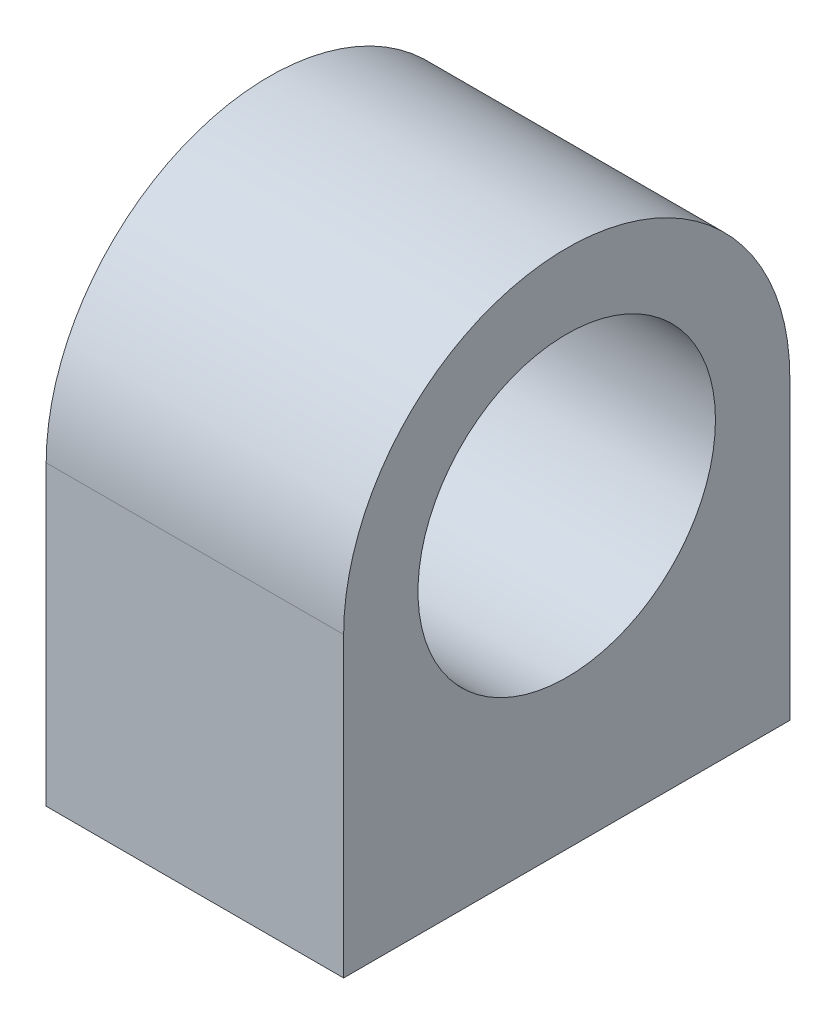
ISO-10303-21;
HEADER;
FILE_DESCRIPTION(('STEP AP214'),'2;1');
FILE_NAME('part.step','',(''),(''),'','','');
FILE_SCHEMA(('AUTOMOTIVE_DESIGN { 1 0 10303 214 1 1 1 1 }'));
ENDSEC;
DATA;
#1=APPLICATION_CONTEXT('core data for automotive mechanical design processes');
#2=APPLICATION_PROTOCOL_DEFINITION('international standard','automotive_design',2000,#1);
#3=PRODUCT_CONTEXT('',#1,'mechanical');
#4=PRODUCT('Part','Part','',(#3));
#5=PRODUCT_RELATED_PRODUCT_CATEGORY('part','',(#4));
#6=PRODUCT_DEFINITION_FORMATION('','',#4);
#7=PRODUCT_DEFINITION_CONTEXT('part definition',#1,'design');
#8=PRODUCT_DEFINITION('design','',#6,#7);
#9=PRODUCT_DEFINITION_SHAPE('','',#8);
#10=(LENGTH_UNIT() NAMED_UNIT(*) SI_UNIT(.MILLI.,.METRE.));
#11=(NAMED_UNIT(*) PLANE_ANGLE_UNIT() SI_UNIT($,.RADIAN.));
#12=(NAMED_UNIT(*) SI_UNIT($,.STERADIAN.) SOLID_ANGLE_UNIT());
#13=UNCERTAINTY_MEASURE_WITH_UNIT(LENGTH_MEASURE(1.E-05),#10,'distance_accuracy_value','');
#14=(GEOMETRIC_REPRESENTATION_CONTEXT(3) GLOBAL_UNCERTAINTY_ASSIGNED_CONTEXT((#13)) GLOBAL_UNIT_ASSIGNED_CONTEXT((#10,
#11,#12)) REPRESENTATION_CONTEXT('',''));
#15=CARTESIAN_POINT('',(0.,0.,0.));
#16=DIRECTION('',(0.,0.,1.));
#17=DIRECTION('',(1.,0.,0.));
#18=AXIS2_PLACEMENT_3D('',#15,#16,#17);
#19=CARTESIAN_POINT('',(0.5,1.,0.));
#20=DIRECTION('',(1.,0.,0.));
#21=DIRECTION('',(0.,0.,-1.));
#22=AXIS2_PLACEMENT_3D('',#19,#20,#21);
#23=PLANE('',#22);
#24=CARTESIAN_POINT('',(0.5,1.,0.));
#25=DIRECTION('',(1.,0.,0.));
#26=DIRECTION('',(0.,0.,-1.));
#27=AXIS2_PLACEMENT_3D('',#24,#25,#26);
#28=CIRCLE('',#27,0.75);
#29=CARTESIAN_POINT('',(0.5,1.,-0.75));
#30=VERTEX_POINT('',#29);
#31=CARTESIAN_POINT('',(0.5,1.,0.75));
#32=VERTEX_POINT('',#31);
#33=EDGE_CURVE('E98',#30,#32,#28,.T.);
#34=ORIENTED_EDGE('',*,*,#33,.T.);
#35=DIRECTION('',(0.,-1.,0.));
#36=VECTOR('',#35,1.);
#37=CARTESIAN_POINT('',(0.5,1.,0.75));
#38=LINE('',#37,#36);
#39=CARTESIAN_POINT('',(0.5,0.,0.75));
#40=VERTEX_POINT('',#39);
#41=EDGE_CURVE('E93',#32,#40,#38,.T.);
#42=ORIENTED_EDGE('',*,*,#41,.T.);
#43=DIRECTION('',(0.,0.,-1.));
#44=VECTOR('',#43,1.);
#45=CARTESIAN_POINT('',(0.5,0.,0.75));
#46=LINE('',#45,#44);
#47=CARTESIAN_POINT('',(0.5,0.,-0.75));
#48=VERTEX_POINT('',#47);
#49=EDGE_CURVE('E96',#40,#48,#46,.T.);
#50=ORIENTED_EDGE('',*,*,#49,.T.);
#51=DIRECTION('',(0.,1.,0.));
#52=VECTOR('',#51,1.);
#53=CARTESIAN_POINT('',(0.5,0.,-0.75));
#54=LINE('',#53,#52);
#55=EDGE_CURVE('E63',#48,#30,#54,.T.);
#56=ORIENTED_EDGE('',*,*,#55,.T.);
#57=EDGE_LOOP('',(#34,#42,#50,#56));
#58=FACE_BOUND('',#57,.T.);
#59=CARTESIAN_POINT('',(0.5,1.,0.));
#60=DIRECTION('',(1.,0.,0.));
#61=DIRECTION('',(0.,0.,-1.));
#62=AXIS2_PLACEMENT_3D('',#59,#60,#61);
#63=CIRCLE('',#62,0.5);
#64=CARTESIAN_POINT('',(0.5,1.,-0.5));
#65=VERTEX_POINT('',#64);
#66=EDGE_CURVE('E118',#65,#65,#63,.T.);
#67=ORIENTED_EDGE('',*,*,#66,.F.);
#68=EDGE_LOOP('',(#67));
#69=FACE_BOUND('',#68,.T.);
#70=ADVANCED_FACE('F45',(#58,#69),#23,.T.);
#71=CARTESIAN_POINT('',(-0.5,1.,0.));
#72=DIRECTION('',(1.,0.,0.));
#73=DIRECTION('',(0.,0.,-1.));
#74=AXIS2_PLACEMENT_3D('',#71,#72,#73);
#75=PLANE('',#74);
#76=CARTESIAN_POINT('',(-0.5,1.,0.));
#77=DIRECTION('',(1.,0.,0.));
#78=DIRECTION('',(0.,0.,-1.));
#79=AXIS2_PLACEMENT_3D('',#76,#77,#78);
#80=CIRCLE('',#79,0.75);
#81=CARTESIAN_POINT('',(-0.5,1.,-0.75));
#82=VERTEX_POINT('',#81);
#83=CARTESIAN_POINT('',(-0.5,1.,0.75));
#84=VERTEX_POINT('',#83);
#85=EDGE_CURVE('E114',#82,#84,#80,.T.);
#86=ORIENTED_EDGE('',*,*,#85,.F.);
#87=DIRECTION('',(0.,1.,0.));
#88=VECTOR('',#87,1.);
#89=CARTESIAN_POINT('',(-0.5,0.,-0.75));
#90=LINE('',#89,#88);
#91=CARTESIAN_POINT('',(-0.5,0.,-0.75));
#92=VERTEX_POINT('',#91);
#93=EDGE_CURVE('E86',#92,#82,#90,.T.);
#94=ORIENTED_EDGE('',*,*,#93,.F.);
#95=DIRECTION('',(0.,0.,-1.));
#96=VECTOR('',#95,1.);
#97=CARTESIAN_POINT('',(-0.5,0.,0.75));
#98=LINE('',#97,#96);
#99=CARTESIAN_POINT('',(-0.5,0.,0.75));
#100=VERTEX_POINT('',#99);
#101=EDGE_CURVE('E80',#100,#92,#98,.T.);
#102=ORIENTED_EDGE('',*,*,#101,.F.);
#103=DIRECTION('',(0.,-1.,0.));
#104=VECTOR('',#103,1.);
#105=CARTESIAN_POINT('',(-0.5,1.,0.75));
#106=LINE('',#105,#104);
#107=EDGE_CURVE('E103',#84,#100,#106,.T.);
#108=ORIENTED_EDGE('',*,*,#107,.F.);
#109=EDGE_LOOP('',(#86,#94,#102,#108));
#110=FACE_BOUND('',#109,.T.);
#111=CARTESIAN_POINT('',(-0.5,1.,0.));
#112=DIRECTION('',(1.,0.,0.));
#113=DIRECTION('',(0.,0.,-1.));
#114=AXIS2_PLACEMENT_3D('',#111,#112,#113);
#115=CIRCLE('',#114,0.5);
#116=CARTESIAN_POINT('',(-0.5,1.,-0.5));
#117=VERTEX_POINT('',#116);
#118=EDGE_CURVE('E136',#117,#117,#115,.T.);
#119=ORIENTED_EDGE('',*,*,#118,.T.);
#120=EDGE_LOOP('',(#119));
#121=FACE_BOUND('',#120,.T.);
#122=ADVANCED_FACE('F131',(#110,#121),#75,.F.);
#123=CARTESIAN_POINT('',(0.5,1.,0.));
#124=DIRECTION('',(-1.,0.,0.));
#125=DIRECTION('',(0.,0.,1.));
#126=AXIS2_PLACEMENT_3D('',#123,#124,#125);
#127=CYLINDRICAL_SURFACE('',#126,0.75);
#128=ORIENTED_EDGE('',*,*,#85,.T.);
#129=DIRECTION('',(-1.,0.,0.));
#130=VECTOR('',#129,1.);
#131=CARTESIAN_POINT('',(0.5,1.,0.75));
#132=LINE('',#131,#130);
#133=EDGE_CURVE('E11',#32,#84,#132,.T.);
#134=ORIENTED_EDGE('',*,*,#133,.F.);
#135=ORIENTED_EDGE('',*,*,#33,.F.);
#136=DIRECTION('',(-1.,0.,0.));
#137=VECTOR('',#136,1.);
#138=CARTESIAN_POINT('',(0.5,1.,-0.75));
#139=LINE('',#138,#137);
#140=EDGE_CURVE('E110',#30,#82,#139,.T.);
#141=ORIENTED_EDGE('',*,*,#140,.T.);
#142=EDGE_LOOP('',(#128,#134,#135,#141));
#143=FACE_BOUND('',#142,.T.);
#144=ADVANCED_FACE('F47',(#143),#127,.T.);
#145=CARTESIAN_POINT('',(0.5,1.,0.75));
#146=DIRECTION('',(0.,0.,-1.));
#147=DIRECTION('',(-1.,0.,0.));
#148=AXIS2_PLACEMENT_3D('',#145,#146,#147);
#149=PLANE('',#148);
#150=ORIENTED_EDGE('',*,*,#107,.T.);
#151=DIRECTION('',(-1.,0.,0.));
#152=VECTOR('',#151,1.);
#153=CARTESIAN_POINT('',(0.5,0.,0.75));
#154=LINE('',#153,#152);
#155=EDGE_CURVE('E55',#40,#100,#154,.T.);
#156=ORIENTED_EDGE('',*,*,#155,.F.);
#157=ORIENTED_EDGE('',*,*,#41,.F.);
#158=ORIENTED_EDGE('',*,*,#133,.T.);
#159=EDGE_LOOP('',(#150,#156,#157,#158));
#160=FACE_BOUND('',#159,.T.);
#161=ADVANCED_FACE('F102',(#160),#149,.F.);
#162=CARTESIAN_POINT('',(0.5,0.,0.75));
#163=DIRECTION('',(0.,1.,0.));
#164=DIRECTION('',(0.,0.,1.));
#165=AXIS2_PLACEMENT_3D('',#162,#163,#164);
#166=PLANE('',#165);
#167=CARTESIAN_POINT('',(0.,0.,0.5));
#168=DIRECTION('',(0.,-1.,0.));
#169=DIRECTION('',(0.,0.,-1.));
#170=AXIS2_PLACEMENT_3D('',#167,#168,#169);
#171=CIRCLE('',#170,0.125000000000014);
#172=CARTESIAN_POINT('',(0.,0.,0.374999999999986));
#173=VERTEX_POINT('',#172);
#174=EDGE_CURVE('E155',#173,#173,#171,.T.);
#175=ORIENTED_EDGE('',*,*,#174,.F.);
#176=EDGE_LOOP('',(#175));
#177=FACE_BOUND('',#176,.T.);
#178=CARTESIAN_POINT('',(0.,0.,-0.5));
#179=DIRECTION('',(0.,-1.,0.));
#180=DIRECTION('',(0.,0.,-1.));
#181=AXIS2_PLACEMENT_3D('',#178,#179,#180);
#182=CIRCLE('',#181,0.125000000000014);
#183=CARTESIAN_POINT('',(0.,0.,-0.625000000000014));
#184=VERTEX_POINT('',#183);
#185=EDGE_CURVE('E147',#184,#184,#182,.T.);
#186=ORIENTED_EDGE('',*,*,#185,.F.);
#187=EDGE_LOOP('',(#186));
#188=FACE_BOUND('',#187,.T.);
#189=ORIENTED_EDGE('',*,*,#101,.T.);
#190=DIRECTION('',(-1.,0.,0.));
#191=VECTOR('',#190,1.);
#192=CARTESIAN_POINT('',(0.5,0.,-0.75));
#193=LINE('',#192,#191);
#194=EDGE_CURVE('E105',#48,#92,#193,.T.);
#195=ORIENTED_EDGE('',*,*,#194,.F.);
#196=ORIENTED_EDGE('',*,*,#49,.F.);
#197=ORIENTED_EDGE('',*,*,#155,.T.);
#198=EDGE_LOOP('',(#189,#195,#196,#197));
#199=FACE_BOUND('',#198,.T.);
#200=ADVANCED_FACE('F106',(#177,#188,#199),#166,.F.);
#201=CARTESIAN_POINT('',(0.5,0.,-0.75));
#202=DIRECTION('',(0.,0.,1.));
#203=DIRECTION('',(1.,0.,0.));
#204=AXIS2_PLACEMENT_3D('',#201,#202,#203);
#205=PLANE('',#204);
#206=ORIENTED_EDGE('',*,*,#93,.T.);
#207=ORIENTED_EDGE('',*,*,#140,.F.);
#208=ORIENTED_EDGE('',*,*,#55,.F.);
#209=ORIENTED_EDGE('',*,*,#194,.T.);
#210=EDGE_LOOP('',(#206,#207,#208,#209));
#211=FACE_BOUND('',#210,.T.);
#212=ADVANCED_FACE('F128',(#211),#205,.F.);
#213=CARTESIAN_POINT('',(0.5,1.,0.));
#214=DIRECTION('',(-1.,0.,0.));
#215=DIRECTION('',(0.,0.,1.));
#216=AXIS2_PLACEMENT_3D('',#213,#214,#215);
#217=CYLINDRICAL_SURFACE('',#216,0.5);
#218=ORIENTED_EDGE('',*,*,#66,.T.);
#219=EDGE_LOOP('',(#218));
#220=FACE_BOUND('',#219,.T.);
#221=ORIENTED_EDGE('',*,*,#118,.F.);
#222=EDGE_LOOP('',(#221));
#223=FACE_BOUND('',#222,.T.);
#224=ADVANCED_FACE('F179',(#220,#223),#217,.F.);
#225=CARTESIAN_POINT('',(0.,0.5,-0.5));
#226=DIRECTION('',(0.,1.,0.));
#227=DIRECTION('',(0.,0.,1.));
#228=AXIS2_PLACEMENT_3D('',#225,#226,#227);
#229=PLANE('',#228);
#230=CARTESIAN_POINT('',(0.,0.5,-0.5));
#231=DIRECTION('',(0.,-1.,0.));
#232=DIRECTION('',(0.,0.,-1.));
#233=AXIS2_PLACEMENT_3D('',#230,#231,#232);
#234=CIRCLE('',#233,0.125000000000013);
#235=CARTESIAN_POINT('',(0.,0.5,-0.625000000000013));
#236=VERTEX_POINT('',#235);
#237=EDGE_CURVE('E140',#236,#236,#234,.T.);
#238=ORIENTED_EDGE('',*,*,#237,.T.);
#239=EDGE_LOOP('',(#238));
#240=FACE_BOUND('',#239,.T.);
#241=ADVANCED_FACE('F170',(#240),#229,.F.);
#242=CARTESIAN_POINT('',(0.,0.,-0.5));
#243=DIRECTION('',(0.,-1.,0.));
#244=DIRECTION('',(0.,0.,-1.));
#245=AXIS2_PLACEMENT_3D('',#242,#243,#244);
#246=CYLINDRICAL_SURFACE('',#245,0.125000000000013);
#247=ORIENTED_EDGE('',*,*,#237,.F.);
#248=EDGE_LOOP('',(#247));
#249=FACE_BOUND('',#248,.T.);
#250=ORIENTED_EDGE('',*,*,#185,.T.);
#251=EDGE_LOOP('',(#250));
#252=FACE_BOUND('',#251,.T.);
#253=ADVANCED_FACE('F167',(#249,#252),#246,.F.);
#254=CARTESIAN_POINT('',(0.,0.5,0.5));
#255=DIRECTION('',(0.,1.,0.));
#256=DIRECTION('',(0.,0.,1.));
#257=AXIS2_PLACEMENT_3D('',#254,#255,#256);
#258=PLANE('',#257);
#259=CARTESIAN_POINT('',(0.,0.5,0.5));
#260=DIRECTION('',(0.,-1.,0.));
#261=DIRECTION('',(0.,0.,-1.));
#262=AXIS2_PLACEMENT_3D('',#259,#260,#261);
#263=CIRCLE('',#262,0.125000000000013);
#264=CARTESIAN_POINT('',(0.,0.5,0.374999999999987));
#265=VERTEX_POINT('',#264);
#266=EDGE_CURVE('E151',#265,#265,#263,.T.);
#267=ORIENTED_EDGE('',*,*,#266,.T.);
#268=EDGE_LOOP('',(#267));
#269=FACE_BOUND('',#268,.T.);
#270=ADVANCED_FACE('F169',(#269),#258,.F.);
#271=CARTESIAN_POINT('',(0.,0.,0.5));
#272=DIRECTION('',(0.,-1.,0.));
#273=DIRECTION('',(0.,0.,-1.));
#274=AXIS2_PLACEMENT_3D('',#271,#272,#273);
#275=CYLINDRICAL_SURFACE('',#274,0.125000000000013);
#276=ORIENTED_EDGE('',*,*,#266,.F.);
#277=EDGE_LOOP('',(#276));
#278=FACE_BOUND('',#277,.T.);
#279=ORIENTED_EDGE('',*,*,#174,.T.);
#280=EDGE_LOOP('',(#279));
#281=FACE_BOUND('',#280,.T.);
#282=ADVANCED_FACE('F160',(#278,#281),#275,.F.);
#283=CLOSED_SHELL('',(#70,#122,#144,#161,#200,#212,#224,#241,#253,#270,#282));
#284=MANIFOLD_SOLID_BREP('B2',#283);
#285=ADVANCED_BREP_SHAPE_REPRESENTATION('',(#18,#284),#14);
#286=SHAPE_DEFINITION_REPRESENTATION(#9,#285);
ENDSEC;
END-ISO-10303-21;
